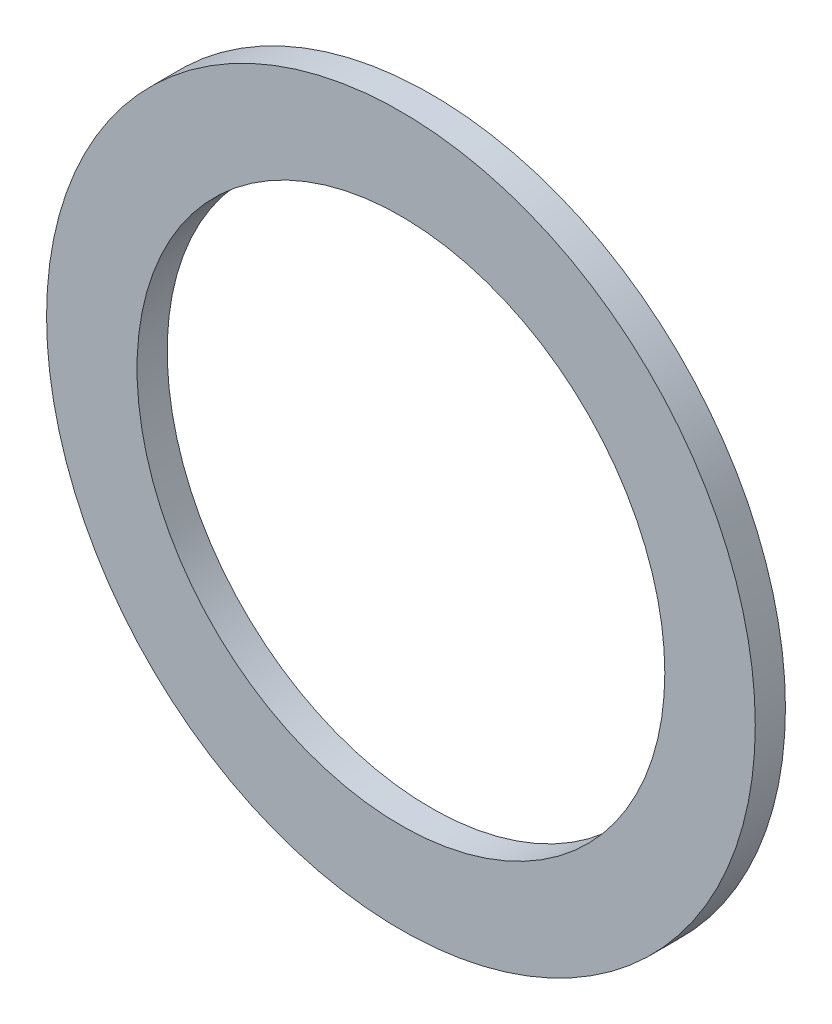
ISO-10303-21;
HEADER;
FILE_DESCRIPTION(('STEP AP214'),'2;1');
FILE_NAME('part.step','',(''),(''),'','','');
FILE_SCHEMA(('AUTOMOTIVE_DESIGN { 1 0 10303 214 1 1 1 1 }'));
ENDSEC;
DATA;
#1=APPLICATION_CONTEXT('core data for automotive mechanical design processes');
#2=APPLICATION_PROTOCOL_DEFINITION('international standard','automotive_design',2000,#1);
#3=PRODUCT_CONTEXT('',#1,'mechanical');
#4=PRODUCT('Part','Part','',(#3));
#5=PRODUCT_RELATED_PRODUCT_CATEGORY('part','',(#4));
#6=PRODUCT_DEFINITION_FORMATION('','',#4);
#7=PRODUCT_DEFINITION_CONTEXT('part definition',#1,'design');
#8=PRODUCT_DEFINITION('design','',#6,#7);
#9=PRODUCT_DEFINITION_SHAPE('','',#8);
#10=(LENGTH_UNIT() NAMED_UNIT(*) SI_UNIT(.MILLI.,.METRE.));
#11=(NAMED_UNIT(*) PLANE_ANGLE_UNIT() SI_UNIT($,.RADIAN.));
#12=(NAMED_UNIT(*) SI_UNIT($,.STERADIAN.) SOLID_ANGLE_UNIT());
#13=UNCERTAINTY_MEASURE_WITH_UNIT(LENGTH_MEASURE(1.E-05),#10,'distance_accuracy_value','');
#14=(GEOMETRIC_REPRESENTATION_CONTEXT(3) GLOBAL_UNCERTAINTY_ASSIGNED_CONTEXT((#13)) GLOBAL_UNIT_ASSIGNED_CONTEXT((#10,
#11,#12)) REPRESENTATION_CONTEXT('',''));
#15=CARTESIAN_POINT('',(0.,0.,0.));
#16=DIRECTION('',(0.,0.,1.));
#17=DIRECTION('',(1.,0.,0.));
#18=AXIS2_PLACEMENT_3D('',#15,#16,#17);
#19=CARTESIAN_POINT('',(0.,0.,2.));
#20=DIRECTION('',(0.,0.,1.));
#21=DIRECTION('',(1.,0.,0.));
#22=AXIS2_PLACEMENT_3D('',#19,#20,#21);
#23=PLANE('',#22);
#24=CARTESIAN_POINT('',(0.,0.,2.));
#25=DIRECTION('',(0.,0.,1.));
#26=DIRECTION('',(1.,0.,0.));
#27=AXIS2_PLACEMENT_3D('',#24,#25,#26);
#28=CIRCLE('',#27,23.5);
#29=CARTESIAN_POINT('',(23.5,0.,2.));
#30=VERTEX_POINT('',#29);
#31=EDGE_CURVE('E10',#30,#30,#28,.T.);
#32=ORIENTED_EDGE('',*,*,#31,.T.);
#33=EDGE_LOOP('',(#32));
#34=FACE_BOUND('',#33,.T.);
#35=CARTESIAN_POINT('',(0.,0.,2.));
#36=DIRECTION('',(0.,0.,1.));
#37=DIRECTION('',(1.,0.,0.));
#38=AXIS2_PLACEMENT_3D('',#35,#36,#37);
#39=CIRCLE('',#38,17.5);
#40=CARTESIAN_POINT('',(17.5,0.,2.));
#41=VERTEX_POINT('',#40);
#42=EDGE_CURVE('E50',#41,#41,#39,.T.);
#43=ORIENTED_EDGE('',*,*,#42,.F.);
#44=EDGE_LOOP('',(#43));
#45=FACE_BOUND('',#44,.T.);
#46=ADVANCED_FACE('F37',(#34,#45),#23,.T.);
#47=CARTESIAN_POINT('',(0.,0.,0.));
#48=DIRECTION('',(0.,0.,1.));
#49=DIRECTION('',(1.,0.,0.));
#50=AXIS2_PLACEMENT_3D('',#47,#48,#49);
#51=PLANE('',#50);
#52=CARTESIAN_POINT('',(0.,0.,0.));
#53=DIRECTION('',(0.,0.,1.));
#54=DIRECTION('',(1.,0.,0.));
#55=AXIS2_PLACEMENT_3D('',#52,#53,#54);
#56=CIRCLE('',#55,23.5);
#57=CARTESIAN_POINT('',(23.5,0.,0.));
#58=VERTEX_POINT('',#57);
#59=EDGE_CURVE('E41',#58,#58,#56,.T.);
#60=ORIENTED_EDGE('',*,*,#59,.F.);
#61=EDGE_LOOP('',(#60));
#62=FACE_BOUND('',#61,.T.);
#63=CARTESIAN_POINT('',(0.,0.,0.));
#64=DIRECTION('',(0.,0.,1.));
#65=DIRECTION('',(1.,0.,0.));
#66=AXIS2_PLACEMENT_3D('',#63,#64,#65);
#67=CIRCLE('',#66,17.5);
#68=CARTESIAN_POINT('',(17.5,0.,0.));
#69=VERTEX_POINT('',#68);
#70=EDGE_CURVE('E52',#69,#69,#67,.T.);
#71=ORIENTED_EDGE('',*,*,#70,.T.);
#72=EDGE_LOOP('',(#71));
#73=FACE_BOUND('',#72,.T.);
#74=ADVANCED_FACE('F64',(#62,#73),#51,.F.);
#75=CARTESIAN_POINT('',(0.,0.,2.));
#76=DIRECTION('',(0.,0.,-1.));
#77=DIRECTION('',(-1.,0.,0.));
#78=AXIS2_PLACEMENT_3D('',#75,#76,#77);
#79=CYLINDRICAL_SURFACE('',#78,23.5);
#80=ORIENTED_EDGE('',*,*,#31,.F.);
#81=EDGE_LOOP('',(#80));
#82=FACE_BOUND('',#81,.T.);
#83=ORIENTED_EDGE('',*,*,#59,.T.);
#84=EDGE_LOOP('',(#83));
#85=FACE_BOUND('',#84,.T.);
#86=ADVANCED_FACE('F39',(#82,#85),#79,.T.);
#87=CARTESIAN_POINT('',(0.,0.,2.));
#88=DIRECTION('',(0.,0.,-1.));
#89=DIRECTION('',(-1.,0.,0.));
#90=AXIS2_PLACEMENT_3D('',#87,#88,#89);
#91=CYLINDRICAL_SURFACE('',#90,17.5);
#92=ORIENTED_EDGE('',*,*,#42,.T.);
#93=EDGE_LOOP('',(#92));
#94=FACE_BOUND('',#93,.T.);
#95=ORIENTED_EDGE('',*,*,#70,.F.);
#96=EDGE_LOOP('',(#95));
#97=FACE_BOUND('',#96,.T.);
#98=ADVANCED_FACE('F60',(#94,#97),#91,.F.);
#99=CLOSED_SHELL('',(#46,#74,#86,#98));
#100=MANIFOLD_SOLID_BREP('B2',#99);
#101=ADVANCED_BREP_SHAPE_REPRESENTATION('',(#18,#100),#14);
#102=SHAPE_DEFINITION_REPRESENTATION(#9,#101);
ENDSEC;
END-ISO-10303-21;
